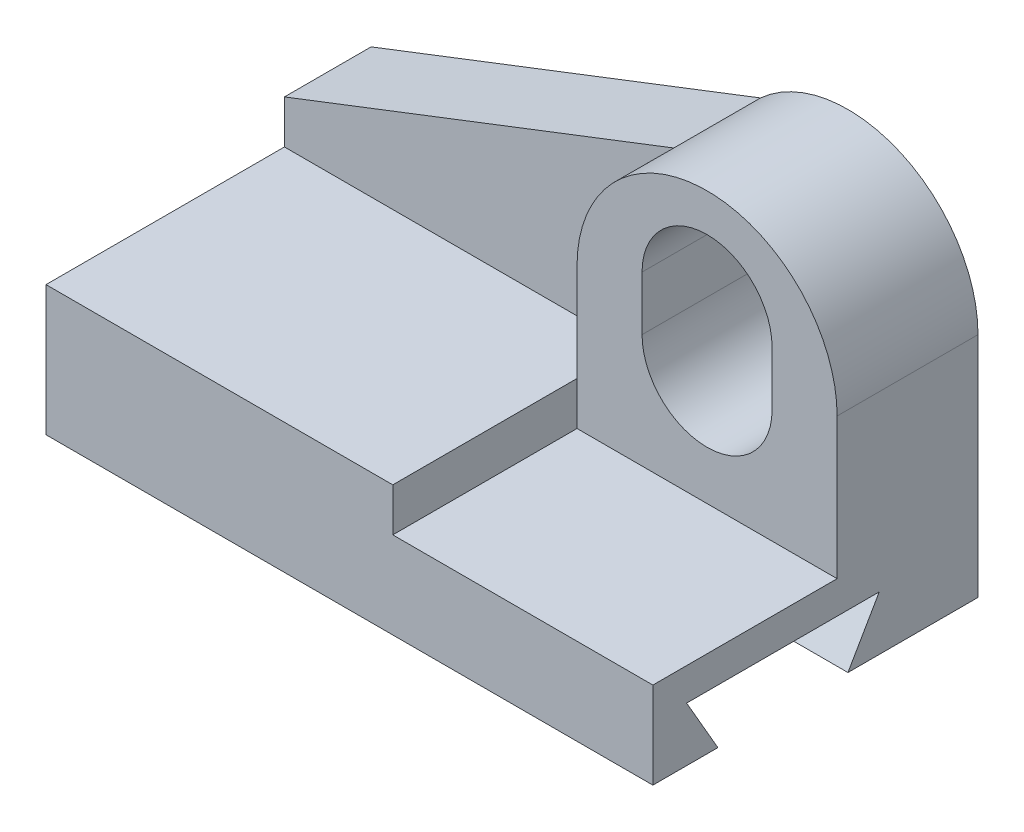
ISO-10303-21;
HEADER;
FILE_DESCRIPTION(('STEP AP214'),'2;1');
FILE_NAME('part.step','',(''),(''),'','','');
FILE_SCHEMA(('AUTOMOTIVE_DESIGN { 1 0 10303 214 1 1 1 1 }'));
ENDSEC;
DATA;
#1=APPLICATION_CONTEXT('core data for automotive mechanical design processes');
#2=APPLICATION_PROTOCOL_DEFINITION('international standard','automotive_design',2000,#1);
#3=PRODUCT_CONTEXT('',#1,'mechanical');
#4=PRODUCT('Part','Part','',(#3));
#5=PRODUCT_RELATED_PRODUCT_CATEGORY('part','',(#4));
#6=PRODUCT_DEFINITION_FORMATION('','',#4);
#7=PRODUCT_DEFINITION_CONTEXT('part definition',#1,'design');
#8=PRODUCT_DEFINITION('design','',#6,#7);
#9=PRODUCT_DEFINITION_SHAPE('','',#8);
#10=(LENGTH_UNIT() NAMED_UNIT(*) SI_UNIT(.MILLI.,.METRE.));
#11=(NAMED_UNIT(*) PLANE_ANGLE_UNIT() SI_UNIT($,.RADIAN.));
#12=(NAMED_UNIT(*) SI_UNIT($,.STERADIAN.) SOLID_ANGLE_UNIT());
#13=UNCERTAINTY_MEASURE_WITH_UNIT(LENGTH_MEASURE(1.E-05),#10,'distance_accuracy_value','');
#14=(GEOMETRIC_REPRESENTATION_CONTEXT(3) GLOBAL_UNCERTAINTY_ASSIGNED_CONTEXT((#13)) GLOBAL_UNIT_ASSIGNED_CONTEXT((#10,
#11,#12)) REPRESENTATION_CONTEXT('',''));
#15=CARTESIAN_POINT('',(0.,0.,0.));
#16=DIRECTION('',(0.,0.,1.));
#17=DIRECTION('',(1.,0.,0.));
#18=AXIS2_PLACEMENT_3D('',#15,#16,#17);
#19=CARTESIAN_POINT('',(0.,8.,0.));
#20=DIRECTION('',(0.,-1.,0.));
#21=DIRECTION('',(0.,0.,-1.));
#22=AXIS2_PLACEMENT_3D('',#19,#20,#21);
#23=PLANE('',#22);
#24=DIRECTION('',(-1.,0.,0.));
#25=VECTOR('',#24,1.);
#26=CARTESIAN_POINT('',(28.,8.,-2.));
#27=LINE('',#26,#25);
#28=CARTESIAN_POINT('',(28.,8.,-2.));
#29=VERTEX_POINT('',#28);
#30=CARTESIAN_POINT('',(4.,8.,-2.));
#31=VERTEX_POINT('',#30);
#32=EDGE_CURVE('E309',#29,#31,#27,.T.);
#33=ORIENTED_EDGE('',*,*,#32,.T.);
#34=DIRECTION('',(0.,0.,-1.));
#35=VECTOR('',#34,1.);
#36=CARTESIAN_POINT('',(4.,8.,15.));
#37=LINE('',#36,#35);
#38=CARTESIAN_POINT('',(4.,8.,15.));
#39=VERTEX_POINT('',#38);
#40=EDGE_CURVE('E222',#39,#31,#37,.T.);
#41=ORIENTED_EDGE('',*,*,#40,.F.);
#42=DIRECTION('',(1.,0.,0.));
#43=VECTOR('',#42,1.);
#44=CARTESIAN_POINT('',(-28.,8.,15.));
#45=LINE('',#44,#43);
#46=CARTESIAN_POINT('',(28.,8.,15.));
#47=VERTEX_POINT('',#46);
#48=EDGE_CURVE('E249',#39,#47,#45,.T.);
#49=ORIENTED_EDGE('',*,*,#48,.T.);
#50=DIRECTION('',(0.,0.,-1.));
#51=VECTOR('',#50,1.);
#52=CARTESIAN_POINT('',(28.,8.,15.));
#53=LINE('',#52,#51);
#54=EDGE_CURVE('E246',#47,#29,#53,.T.);
#55=ORIENTED_EDGE('',*,*,#54,.T.);
#56=EDGE_LOOP('',(#33,#41,#49,#55));
#57=FACE_BOUND('',#56,.T.);
#58=ADVANCED_FACE('F41',(#57),#23,.F.);
#59=CARTESIAN_POINT('',(4.,12.,15.));
#60=DIRECTION('',(-1.,0.,0.));
#61=DIRECTION('',(0.,0.,1.));
#62=AXIS2_PLACEMENT_3D('',#59,#60,#61);
#63=PLANE('',#62);
#64=DIRECTION('',(0.,1.,0.));
#65=VECTOR('',#64,1.);
#66=CARTESIAN_POINT('',(4.,8.,-2.));
#67=LINE('',#66,#65);
#68=CARTESIAN_POINT('',(4.,12.,-2.));
#69=VERTEX_POINT('',#68);
#70=EDGE_CURVE('E301',#31,#69,#67,.T.);
#71=ORIENTED_EDGE('',*,*,#70,.T.);
#72=DIRECTION('',(0.,0.,-1.));
#73=VECTOR('',#72,1.);
#74=CARTESIAN_POINT('',(4.,12.,15.));
#75=LINE('',#74,#73);
#76=CARTESIAN_POINT('',(4.,12.,15.));
#77=VERTEX_POINT('',#76);
#78=EDGE_CURVE('E234',#77,#69,#75,.T.);
#79=ORIENTED_EDGE('',*,*,#78,.F.);
#80=DIRECTION('',(0.,-1.,0.));
#81=VECTOR('',#80,1.);
#82=CARTESIAN_POINT('',(4.,12.,15.));
#83=LINE('',#82,#81);
#84=EDGE_CURVE('E240',#77,#39,#83,.T.);
#85=ORIENTED_EDGE('',*,*,#84,.T.);
#86=ORIENTED_EDGE('',*,*,#40,.T.);
#87=EDGE_LOOP('',(#71,#79,#85,#86));
#88=FACE_BOUND('',#87,.T.);
#89=ADVANCED_FACE('F358',(#88),#63,.F.);
#90=CARTESIAN_POINT('',(0.,0.,0.));
#91=DIRECTION('',(0.,-1.,0.));
#92=DIRECTION('',(0.,0.,-1.));
#93=AXIS2_PLACEMENT_3D('',#90,#91,#92);
#94=PLANE('',#93);
#95=DIRECTION('',(-1.,0.,0.));
#96=VECTOR('',#95,1.);
#97=CARTESIAN_POINT('',(28.,0.,-3.));
#98=LINE('',#97,#96);
#99=CARTESIAN_POINT('',(28.,0.,-3.));
#100=VERTEX_POINT('',#99);
#101=CARTESIAN_POINT('',(-28.,0.,-3.));
#102=VERTEX_POINT('',#101);
#103=EDGE_CURVE('E223',#100,#102,#98,.T.);
#104=ORIENTED_EDGE('',*,*,#103,.T.);
#105=DIRECTION('',(0.,0.,1.));
#106=VECTOR('',#105,1.);
#107=CARTESIAN_POINT('',(-28.,0.,15.));
#108=LINE('',#107,#106);
#109=CARTESIAN_POINT('',(-28.,0.,-15.));
#110=VERTEX_POINT('',#109);
#111=EDGE_CURVE('E258',#110,#102,#108,.T.);
#112=ORIENTED_EDGE('',*,*,#111,.F.);
#113=DIRECTION('',(-1.,0.,0.));
#114=VECTOR('',#113,1.);
#115=CARTESIAN_POINT('',(-28.,0.,-15.));
#116=LINE('',#115,#114);
#117=CARTESIAN_POINT('',(28.,0.,-15.));
#118=VERTEX_POINT('',#117);
#119=EDGE_CURVE('E183',#118,#110,#116,.T.);
#120=ORIENTED_EDGE('',*,*,#119,.F.);
#121=DIRECTION('',(0.,0.,-1.));
#122=VECTOR('',#121,1.);
#123=CARTESIAN_POINT('',(28.,0.,15.));
#124=LINE('',#123,#122);
#125=EDGE_CURVE('E245',#100,#118,#124,.T.);
#126=ORIENTED_EDGE('',*,*,#125,.F.);
#127=EDGE_LOOP('',(#104,#112,#120,#126));
#128=FACE_BOUND('',#127,.T.);
#129=ADVANCED_FACE('F332',(#128),#94,.T.);
#130=CARTESIAN_POINT('',(28.,8.,15.));
#131=DIRECTION('',(-1.,0.,0.));
#132=DIRECTION('',(0.,0.,1.));
#133=AXIS2_PLACEMENT_3D('',#130,#131,#132);
#134=PLANE('',#133);
#135=ORIENTED_EDGE('',*,*,#125,.T.);
#136=DIRECTION('',(0.,-1.,0.));
#137=VECTOR('',#136,1.);
#138=CARTESIAN_POINT('',(28.,8.,-15.));
#139=LINE('',#138,#137);
#140=CARTESIAN_POINT('',(28.,21.,-15.));
#141=VERTEX_POINT('',#140);
#142=EDGE_CURVE('E186',#141,#118,#139,.T.);
#143=ORIENTED_EDGE('',*,*,#142,.F.);
#144=DIRECTION('',(0.,0.,-1.));
#145=VECTOR('',#144,1.);
#146=CARTESIAN_POINT('',(28.,21.,-2.));
#147=LINE('',#146,#145);
#148=CARTESIAN_POINT('',(28.,21.,-2.));
#149=VERTEX_POINT('',#148);
#150=EDGE_CURVE('E198',#149,#141,#147,.T.);
#151=ORIENTED_EDGE('',*,*,#150,.F.);
#152=DIRECTION('',(0.,1.,0.));
#153=VECTOR('',#152,1.);
#154=CARTESIAN_POINT('',(28.,8.,-2.));
#155=LINE('',#154,#153);
#156=EDGE_CURVE('E307',#29,#149,#155,.T.);
#157=ORIENTED_EDGE('',*,*,#156,.F.);
#158=ORIENTED_EDGE('',*,*,#54,.F.);
#159=DIRECTION('',(0.,-1.,0.));
#160=VECTOR('',#159,1.);
#161=CARTESIAN_POINT('',(28.,8.,15.));
#162=LINE('',#161,#160);
#163=CARTESIAN_POINT('',(28.,0.,15.));
#164=VERTEX_POINT('',#163);
#165=EDGE_CURVE('E252',#47,#164,#162,.T.);
#166=ORIENTED_EDGE('',*,*,#165,.T.);
#167=CARTESIAN_POINT('',(28.,0.,9.));
#168=VERTEX_POINT('',#167);
#169=EDGE_CURVE('E253',#164,#168,#124,.T.);
#170=ORIENTED_EDGE('',*,*,#169,.T.);
#171=DIRECTION('',(0.,0.866025403784436,0.500000000000004));
#172=VECTOR('',#171,1.);
#173=CARTESIAN_POINT('',(28.,0.,9.));
#174=LINE('',#173,#172);
#175=CARTESIAN_POINT('',(28.,5.,11.8867513459482));
#176=VERTEX_POINT('',#175);
#177=EDGE_CURVE('E204',#168,#176,#174,.T.);
#178=ORIENTED_EDGE('',*,*,#177,.T.);
#179=DIRECTION('',(0.,0.,1.));
#180=VECTOR('',#179,1.);
#181=CARTESIAN_POINT('',(28.,5.,-5.88675134594812));
#182=LINE('',#181,#180);
#183=CARTESIAN_POINT('',(28.,5.,-5.88675134594812));
#184=VERTEX_POINT('',#183);
#185=EDGE_CURVE('E207',#184,#176,#182,.T.);
#186=ORIENTED_EDGE('',*,*,#185,.F.);
#187=DIRECTION('',(0.,0.86602540378444,-0.499999999999998));
#188=VECTOR('',#187,1.);
#189=CARTESIAN_POINT('',(28.,0.,-3.));
#190=LINE('',#189,#188);
#191=EDGE_CURVE('E210',#100,#184,#190,.T.);
#192=ORIENTED_EDGE('',*,*,#191,.F.);
#193=EDGE_LOOP('',(#135,#143,#151,#157,#158,#166,#170,#178,#186,#192));
#194=FACE_BOUND('',#193,.T.);
#195=ADVANCED_FACE('F43',(#194),#134,.F.);
#196=CARTESIAN_POINT('',(-28.,8.,-15.));
#197=DIRECTION('',(0.,0.,1.));
#198=DIRECTION('',(1.,0.,0.));
#199=AXIS2_PLACEMENT_3D('',#196,#197,#198);
#200=PLANE('',#199);
#201=DIRECTION('',(0.,-1.,0.));
#202=VECTOR('',#201,1.);
#203=CARTESIAN_POINT('',(-28.,8.,-15.));
#204=LINE('',#203,#202);
#205=CARTESIAN_POINT('',(-28.,16.,-15.));
#206=VERTEX_POINT('',#205);
#207=EDGE_CURVE('E178',#206,#110,#204,.T.);
#208=ORIENTED_EDGE('',*,*,#207,.F.);
#209=DIRECTION('',(0.932798134405597,0.360399279202162,0.));
#210=VECTOR('',#209,1.);
#211=CARTESIAN_POINT('',(-28.,16.,-15.));
#212=LINE('',#211,#210);
#213=CARTESIAN_POINT('',(7.93168539325843,29.8826966292135,-15.));
#214=VERTEX_POINT('',#213);
#215=EDGE_CURVE('E56',#206,#214,#212,.T.);
#216=ORIENTED_EDGE('',*,*,#215,.T.);
#217=CARTESIAN_POINT('',(16.,21.,-15.));
#218=DIRECTION('',(0.,0.,-1.));
#219=DIRECTION('',(-1.,0.,0.));
#220=AXIS2_PLACEMENT_3D('',#217,#218,#219);
#221=CIRCLE('',#220,12.);
#222=EDGE_CURVE('E289',#214,#141,#221,.T.);
#223=ORIENTED_EDGE('',*,*,#222,.T.);
#224=ORIENTED_EDGE('',*,*,#142,.T.);
#225=ORIENTED_EDGE('',*,*,#119,.T.);
#226=EDGE_LOOP('',(#208,#216,#223,#224,#225));
#227=FACE_BOUND('',#226,.T.);
#228=DIRECTION('',(0.,-1.,0.));
#229=VECTOR('',#228,1.);
#230=CARTESIAN_POINT('',(22.,18.5,-15.));
#231=LINE('',#230,#229);
#232=CARTESIAN_POINT('',(22.,23.5,-15.));
#233=VERTEX_POINT('',#232);
#234=CARTESIAN_POINT('',(22.,18.5,-15.));
#235=VERTEX_POINT('',#234);
#236=EDGE_CURVE('E369',#233,#235,#231,.T.);
#237=ORIENTED_EDGE('',*,*,#236,.F.);
#238=CARTESIAN_POINT('',(16.,23.5,-15.));
#239=DIRECTION('',(0.,0.,-1.));
#240=DIRECTION('',(1.,0.,0.));
#241=AXIS2_PLACEMENT_3D('',#238,#239,#240);
#242=CIRCLE('',#241,6.);
#243=CARTESIAN_POINT('',(10.,23.5,-15.));
#244=VERTEX_POINT('',#243);
#245=EDGE_CURVE('E365',#244,#233,#242,.T.);
#246=ORIENTED_EDGE('',*,*,#245,.F.);
#247=DIRECTION('',(0.,1.,0.));
#248=VECTOR('',#247,1.);
#249=CARTESIAN_POINT('',(10.,23.5,-15.));
#250=LINE('',#249,#248);
#251=CARTESIAN_POINT('',(10.,18.5,-15.));
#252=VERTEX_POINT('',#251);
#253=EDGE_CURVE('E287',#252,#244,#250,.T.);
#254=ORIENTED_EDGE('',*,*,#253,.F.);
#255=CARTESIAN_POINT('',(16.,18.5,-15.));
#256=DIRECTION('',(0.,0.,-1.));
#257=DIRECTION('',(-1.,0.,0.));
#258=AXIS2_PLACEMENT_3D('',#255,#256,#257);
#259=CIRCLE('',#258,5.99999999999999);
#260=EDGE_CURVE('E370',#235,#252,#259,.T.);
#261=ORIENTED_EDGE('',*,*,#260,.F.);
#262=EDGE_LOOP('',(#237,#246,#254,#261));
#263=FACE_BOUND('',#262,.T.);
#264=ADVANCED_FACE('F179',(#227,#263),#200,.F.);
#265=CARTESIAN_POINT('',(-28.,8.,15.));
#266=DIRECTION('',(1.,0.,0.));
#267=DIRECTION('',(0.,0.,-1.));
#268=AXIS2_PLACEMENT_3D('',#265,#266,#267);
#269=PLANE('',#268);
#270=DIRECTION('',(0.,0.,1.));
#271=VECTOR('',#270,1.);
#272=CARTESIAN_POINT('',(-28.,12.,15.));
#273=LINE('',#272,#271);
#274=CARTESIAN_POINT('',(-28.,12.,-7.));
#275=VERTEX_POINT('',#274);
#276=CARTESIAN_POINT('',(-28.,12.,15.));
#277=VERTEX_POINT('',#276);
#278=EDGE_CURVE('E229',#275,#277,#273,.T.);
#279=ORIENTED_EDGE('',*,*,#278,.F.);
#280=DIRECTION('',(0.,-1.,0.));
#281=VECTOR('',#280,1.);
#282=CARTESIAN_POINT('',(-28.,16.,-7.));
#283=LINE('',#282,#281);
#284=CARTESIAN_POINT('',(-28.,16.,-7.));
#285=VERTEX_POINT('',#284);
#286=EDGE_CURVE('E192',#285,#275,#283,.T.);
#287=ORIENTED_EDGE('',*,*,#286,.F.);
#288=DIRECTION('',(0.,0.,1.));
#289=VECTOR('',#288,1.);
#290=CARTESIAN_POINT('',(-28.,16.,-15.));
#291=LINE('',#290,#289);
#292=EDGE_CURVE('E171',#206,#285,#291,.T.);
#293=ORIENTED_EDGE('',*,*,#292,.F.);
#294=ORIENTED_EDGE('',*,*,#207,.T.);
#295=ORIENTED_EDGE('',*,*,#111,.T.);
#296=DIRECTION('',(0.,0.86602540378444,-0.499999999999998));
#297=VECTOR('',#296,1.);
#298=CARTESIAN_POINT('',(-28.,0.,-3.));
#299=LINE('',#298,#297);
#300=CARTESIAN_POINT('',(-28.,5.,-5.88675134594812));
#301=VERTEX_POINT('',#300);
#302=EDGE_CURVE('E208',#102,#301,#299,.T.);
#303=ORIENTED_EDGE('',*,*,#302,.T.);
#304=DIRECTION('',(0.,0.,1.));
#305=VECTOR('',#304,1.);
#306=CARTESIAN_POINT('',(-28.,5.,-5.88675134594812));
#307=LINE('',#306,#305);
#308=CARTESIAN_POINT('',(-28.,5.,11.8867513459482));
#309=VERTEX_POINT('',#308);
#310=EDGE_CURVE('E215',#301,#309,#307,.T.);
#311=ORIENTED_EDGE('',*,*,#310,.T.);
#312=DIRECTION('',(0.,0.866025403784436,0.500000000000004));
#313=VECTOR('',#312,1.);
#314=CARTESIAN_POINT('',(-28.,0.,9.));
#315=LINE('',#314,#313);
#316=CARTESIAN_POINT('',(-28.,0.,9.));
#317=VERTEX_POINT('',#316);
#318=EDGE_CURVE('E203',#317,#309,#315,.T.);
#319=ORIENTED_EDGE('',*,*,#318,.F.);
#320=CARTESIAN_POINT('',(-28.,0.,15.));
#321=VERTEX_POINT('',#320);
#322=EDGE_CURVE('E257',#317,#321,#108,.T.);
#323=ORIENTED_EDGE('',*,*,#322,.T.);
#324=DIRECTION('',(0.,-1.,0.));
#325=VECTOR('',#324,1.);
#326=CARTESIAN_POINT('',(-28.,8.,15.));
#327=LINE('',#326,#325);
#328=EDGE_CURVE('E187',#277,#321,#327,.T.);
#329=ORIENTED_EDGE('',*,*,#328,.F.);
#330=EDGE_LOOP('',(#279,#287,#293,#294,#295,#303,#311,#319,#323,#329));
#331=FACE_BOUND('',#330,.T.);
#332=ADVANCED_FACE('F191',(#331),#269,.F.);
#333=CARTESIAN_POINT('',(-28.,8.,15.));
#334=DIRECTION('',(0.,0.,-1.));
#335=DIRECTION('',(-1.,0.,0.));
#336=AXIS2_PLACEMENT_3D('',#333,#334,#335);
#337=PLANE('',#336);
#338=DIRECTION('',(1.,0.,0.));
#339=VECTOR('',#338,1.);
#340=CARTESIAN_POINT('',(-28.,0.,15.));
#341=LINE('',#340,#339);
#342=EDGE_CURVE('E250',#321,#164,#341,.T.);
#343=ORIENTED_EDGE('',*,*,#342,.T.);
#344=ORIENTED_EDGE('',*,*,#165,.F.);
#345=ORIENTED_EDGE('',*,*,#48,.F.);
#346=ORIENTED_EDGE('',*,*,#84,.F.);
#347=DIRECTION('',(1.,0.,0.));
#348=VECTOR('',#347,1.);
#349=CARTESIAN_POINT('',(-28.,12.,15.));
#350=LINE('',#349,#348);
#351=EDGE_CURVE('E232',#277,#77,#350,.T.);
#352=ORIENTED_EDGE('',*,*,#351,.F.);
#353=ORIENTED_EDGE('',*,*,#328,.T.);
#354=EDGE_LOOP('',(#343,#344,#345,#346,#352,#353));
#355=FACE_BOUND('',#354,.T.);
#356=ADVANCED_FACE('F351',(#355),#337,.F.);
#357=DIRECTION('',(-1.,0.,0.));
#358=VECTOR('',#357,1.);
#359=CARTESIAN_POINT('',(28.,0.,9.));
#360=LINE('',#359,#358);
#361=EDGE_CURVE('E220',#168,#317,#360,.T.);
#362=ORIENTED_EDGE('',*,*,#361,.F.);
#363=ORIENTED_EDGE('',*,*,#169,.F.);
#364=ORIENTED_EDGE('',*,*,#342,.F.);
#365=ORIENTED_EDGE('',*,*,#322,.F.);
#366=EDGE_LOOP('',(#362,#363,#364,#365));
#367=FACE_BOUND('',#366,.T.);
#368=ADVANCED_FACE('F347',(#367),#94,.T.);
#369=CARTESIAN_POINT('',(0.,12.,0.));
#370=DIRECTION('',(0.,-1.,0.));
#371=DIRECTION('',(0.,0.,-1.));
#372=AXIS2_PLACEMENT_3D('',#369,#370,#371);
#373=PLANE('',#372);
#374=ORIENTED_EDGE('',*,*,#278,.T.);
#375=ORIENTED_EDGE('',*,*,#351,.T.);
#376=ORIENTED_EDGE('',*,*,#78,.T.);
#377=DIRECTION('',(0.,0.,-1.));
#378=VECTOR('',#377,1.);
#379=CARTESIAN_POINT('',(4.,12.,0.));
#380=LINE('',#379,#378);
#381=CARTESIAN_POINT('',(4.,12.,-7.));
#382=VERTEX_POINT('',#381);
#383=EDGE_CURVE('E194',#69,#382,#380,.T.);
#384=ORIENTED_EDGE('',*,*,#383,.T.);
#385=DIRECTION('',(-1.,0.,0.));
#386=VECTOR('',#385,1.);
#387=CARTESIAN_POINT('',(-28.,12.,-7.));
#388=LINE('',#387,#386);
#389=EDGE_CURVE('E237',#382,#275,#388,.T.);
#390=ORIENTED_EDGE('',*,*,#389,.T.);
#391=EDGE_LOOP('',(#374,#375,#376,#384,#390));
#392=FACE_BOUND('',#391,.T.);
#393=ADVANCED_FACE('F360',(#392),#373,.F.);
#394=CARTESIAN_POINT('',(28.,0.,9.));
#395=DIRECTION('',(0.,-0.500000000000004,0.866025403784436));
#396=DIRECTION('',(0.,-0.866025403784437,-0.500000000000004));
#397=AXIS2_PLACEMENT_3D('',#394,#395,#396);
#398=PLANE('',#397);
#399=ORIENTED_EDGE('',*,*,#318,.T.);
#400=DIRECTION('',(-1.,0.,0.));
#401=VECTOR('',#400,1.);
#402=CARTESIAN_POINT('',(28.,5.,11.8867513459482));
#403=LINE('',#402,#401);
#404=EDGE_CURVE('E212',#176,#309,#403,.T.);
#405=ORIENTED_EDGE('',*,*,#404,.F.);
#406=ORIENTED_EDGE('',*,*,#177,.F.);
#407=ORIENTED_EDGE('',*,*,#361,.T.);
#408=EDGE_LOOP('',(#399,#405,#406,#407));
#409=FACE_BOUND('',#408,.T.);
#410=ADVANCED_FACE('F426',(#409),#398,.F.);
#411=CARTESIAN_POINT('',(28.,0.,-3.));
#412=DIRECTION('',(0.,0.499999999999998,0.86602540378444));
#413=DIRECTION('',(0.,-0.86602540378444,0.499999999999998));
#414=AXIS2_PLACEMENT_3D('',#411,#412,#413);
#415=PLANE('',#414);
#416=ORIENTED_EDGE('',*,*,#302,.F.);
#417=ORIENTED_EDGE('',*,*,#103,.F.);
#418=ORIENTED_EDGE('',*,*,#191,.T.);
#419=DIRECTION('',(-1.,0.,0.));
#420=VECTOR('',#419,1.);
#421=CARTESIAN_POINT('',(28.,5.,-5.88675134594812));
#422=LINE('',#421,#420);
#423=EDGE_CURVE('E226',#184,#301,#422,.T.);
#424=ORIENTED_EDGE('',*,*,#423,.T.);
#425=EDGE_LOOP('',(#416,#417,#418,#424));
#426=FACE_BOUND('',#425,.T.);
#427=ADVANCED_FACE('F335',(#426),#415,.T.);
#428=CARTESIAN_POINT('',(28.,5.,-5.88675134594812));
#429=DIRECTION('',(0.,-1.,0.));
#430=DIRECTION('',(0.,0.,-1.));
#431=AXIS2_PLACEMENT_3D('',#428,#429,#430);
#432=PLANE('',#431);
#433=ORIENTED_EDGE('',*,*,#310,.F.);
#434=ORIENTED_EDGE('',*,*,#423,.F.);
#435=ORIENTED_EDGE('',*,*,#185,.T.);
#436=ORIENTED_EDGE('',*,*,#404,.T.);
#437=EDGE_LOOP('',(#433,#434,#435,#436));
#438=FACE_BOUND('',#437,.T.);
#439=ADVANCED_FACE('F339',(#438),#432,.T.);
#440=CARTESIAN_POINT('',(-28.,16.,-7.));
#441=DIRECTION('',(0.,0.,-1.));
#442=DIRECTION('',(-1.,0.,0.));
#443=AXIS2_PLACEMENT_3D('',#440,#441,#442);
#444=PLANE('',#443);
#445=ORIENTED_EDGE('',*,*,#286,.T.);
#446=ORIENTED_EDGE('',*,*,#389,.F.);
#447=DIRECTION('',(0.,-1.,0.));
#448=VECTOR('',#447,1.);
#449=CARTESIAN_POINT('',(4.,16.,-7.));
#450=LINE('',#449,#448);
#451=CARTESIAN_POINT('',(4.,21.,-7.));
#452=VERTEX_POINT('',#451);
#453=EDGE_CURVE('E193',#452,#382,#450,.T.);
#454=ORIENTED_EDGE('',*,*,#453,.F.);
#455=CARTESIAN_POINT('',(16.,21.,-7.));
#456=DIRECTION('',(0.,0.,1.));
#457=DIRECTION('',(1.,0.,0.));
#458=AXIS2_PLACEMENT_3D('',#455,#456,#457);
#459=CIRCLE('',#458,12.);
#460=CARTESIAN_POINT('',(7.93168539325843,29.8826966292135,-7.));
#461=VERTEX_POINT('',#460);
#462=EDGE_CURVE('E322',#452,#461,#459,.F.);
#463=ORIENTED_EDGE('',*,*,#462,.T.);
#464=DIRECTION('',(0.932798134405597,0.360399279202162,0.));
#465=VECTOR('',#464,1.);
#466=CARTESIAN_POINT('',(-28.,16.,-7.));
#467=LINE('',#466,#465);
#468=EDGE_CURVE('E175',#285,#461,#467,.T.);
#469=ORIENTED_EDGE('',*,*,#468,.F.);
#470=EDGE_LOOP('',(#445,#446,#454,#463,#469));
#471=FACE_BOUND('',#470,.T.);
#472=ADVANCED_FACE('F363',(#471),#444,.F.);
#473=CARTESIAN_POINT('',(4.,8.,-2.));
#474=DIRECTION('',(-1.,0.,0.));
#475=DIRECTION('',(0.,0.,1.));
#476=AXIS2_PLACEMENT_3D('',#473,#474,#475);
#477=PLANE('',#476);
#478=DIRECTION('',(0.,0.,-1.));
#479=VECTOR('',#478,1.);
#480=CARTESIAN_POINT('',(4.,21.,-2.));
#481=LINE('',#480,#479);
#482=CARTESIAN_POINT('',(4.,21.,-2.));
#483=VERTEX_POINT('',#482);
#484=EDGE_CURVE('E311',#483,#452,#481,.T.);
#485=ORIENTED_EDGE('',*,*,#484,.T.);
#486=ORIENTED_EDGE('',*,*,#453,.T.);
#487=ORIENTED_EDGE('',*,*,#383,.F.);
#488=EDGE_CURVE('E292',#69,#483,#67,.T.);
#489=ORIENTED_EDGE('',*,*,#488,.T.);
#490=EDGE_LOOP('',(#485,#486,#487,#489));
#491=FACE_BOUND('',#490,.T.);
#492=ADVANCED_FACE('F316',(#491),#477,.T.);
#493=CARTESIAN_POINT('',(16.,21.,-2.));
#494=DIRECTION('',(0.,0.,-1.));
#495=DIRECTION('',(-1.,0.,0.));
#496=AXIS2_PLACEMENT_3D('',#493,#494,#495);
#497=CYLINDRICAL_SURFACE('',#496,12.);
#498=ORIENTED_EDGE('',*,*,#150,.T.);
#499=ORIENTED_EDGE('',*,*,#222,.F.);
#500=DIRECTION('',(0.,0.,-1.));
#501=VECTOR('',#500,1.);
#502=CARTESIAN_POINT('',(7.93168539325844,29.8826966292135,-2.));
#503=LINE('',#502,#501);
#504=EDGE_CURVE('E11',#461,#214,#503,.T.);
#505=ORIENTED_EDGE('',*,*,#504,.F.);
#506=ORIENTED_EDGE('',*,*,#462,.F.);
#507=ORIENTED_EDGE('',*,*,#484,.F.);
#508=CARTESIAN_POINT('',(16.,21.,-2.));
#509=DIRECTION('',(0.,0.,-1.));
#510=DIRECTION('',(-1.,0.,0.));
#511=AXIS2_PLACEMENT_3D('',#508,#509,#510);
#512=CIRCLE('',#511,12.);
#513=EDGE_CURVE('E304',#483,#149,#512,.T.);
#514=ORIENTED_EDGE('',*,*,#513,.T.);
#515=EDGE_LOOP('',(#498,#499,#505,#506,#507,#514));
#516=FACE_BOUND('',#515,.T.);
#517=ADVANCED_FACE('F321',(#516),#497,.T.);
#518=CARTESIAN_POINT('',(16.,21.,-2.));
#519=DIRECTION('',(0.,0.,-1.));
#520=DIRECTION('',(-1.,0.,0.));
#521=AXIS2_PLACEMENT_3D('',#518,#519,#520);
#522=PLANE('',#521);
#523=DIRECTION('',(0.,1.,0.));
#524=VECTOR('',#523,1.);
#525=CARTESIAN_POINT('',(10.,21.,-2.));
#526=LINE('',#525,#524);
#527=CARTESIAN_POINT('',(10.,18.5,-2.));
#528=VERTEX_POINT('',#527);
#529=CARTESIAN_POINT('',(10.,23.5,-2.));
#530=VERTEX_POINT('',#529);
#531=EDGE_CURVE('E272',#528,#530,#526,.T.);
#532=ORIENTED_EDGE('',*,*,#531,.T.);
#533=CARTESIAN_POINT('',(16.,23.5,-2.));
#534=DIRECTION('',(0.,0.,-1.));
#535=DIRECTION('',(-1.,0.,0.));
#536=AXIS2_PLACEMENT_3D('',#533,#534,#535);
#537=CIRCLE('',#536,6.);
#538=CARTESIAN_POINT('',(22.,23.5,-2.));
#539=VERTEX_POINT('',#538);
#540=EDGE_CURVE('E49',#530,#539,#537,.T.);
#541=ORIENTED_EDGE('',*,*,#540,.T.);
#542=DIRECTION('',(0.,-1.,0.));
#543=VECTOR('',#542,1.);
#544=CARTESIAN_POINT('',(22.,21.,-2.));
#545=LINE('',#544,#543);
#546=CARTESIAN_POINT('',(22.,18.5,-2.));
#547=VERTEX_POINT('',#546);
#548=EDGE_CURVE('E266',#539,#547,#545,.T.);
#549=ORIENTED_EDGE('',*,*,#548,.T.);
#550=CARTESIAN_POINT('',(16.,18.5,-2.));
#551=DIRECTION('',(0.,0.,-1.));
#552=DIRECTION('',(-1.,0.,0.));
#553=AXIS2_PLACEMENT_3D('',#550,#551,#552);
#554=CIRCLE('',#553,5.99999999999999);
#555=EDGE_CURVE('E269',#547,#528,#554,.T.);
#556=ORIENTED_EDGE('',*,*,#555,.T.);
#557=EDGE_LOOP('',(#532,#541,#549,#556));
#558=FACE_BOUND('',#557,.T.);
#559=ORIENTED_EDGE('',*,*,#70,.F.);
#560=ORIENTED_EDGE('',*,*,#32,.F.);
#561=ORIENTED_EDGE('',*,*,#156,.T.);
#562=ORIENTED_EDGE('',*,*,#513,.F.);
#563=ORIENTED_EDGE('',*,*,#488,.F.);
#564=EDGE_LOOP('',(#559,#560,#561,#562,#563));
#565=FACE_BOUND('',#564,.T.);
#566=ADVANCED_FACE('F276',(#558,#565),#522,.F.);
#567=CARTESIAN_POINT('',(16.,23.5,15.));
#568=DIRECTION('',(0.,0.,-1.));
#569=DIRECTION('',(-1.,0.,0.));
#570=AXIS2_PLACEMENT_3D('',#567,#568,#569);
#571=CYLINDRICAL_SURFACE('',#570,6.);
#572=DIRECTION('',(0.,0.,-1.));
#573=VECTOR('',#572,1.);
#574=CARTESIAN_POINT('',(10.,23.5,15.));
#575=LINE('',#574,#573);
#576=EDGE_CURVE('E281',#530,#244,#575,.T.);
#577=ORIENTED_EDGE('',*,*,#576,.T.);
#578=ORIENTED_EDGE('',*,*,#245,.T.);
#579=DIRECTION('',(0.,0.,-1.));
#580=VECTOR('',#579,1.);
#581=CARTESIAN_POINT('',(22.,23.5,15.));
#582=LINE('',#581,#580);
#583=EDGE_CURVE('E63',#539,#233,#582,.T.);
#584=ORIENTED_EDGE('',*,*,#583,.F.);
#585=ORIENTED_EDGE('',*,*,#540,.F.);
#586=EDGE_LOOP('',(#577,#578,#584,#585));
#587=FACE_BOUND('',#586,.T.);
#588=ADVANCED_FACE('F280',(#587),#571,.F.);
#589=CARTESIAN_POINT('',(10.,23.5,15.));
#590=DIRECTION('',(-1.,0.,0.));
#591=DIRECTION('',(0.,-1.,0.));
#592=AXIS2_PLACEMENT_3D('',#589,#590,#591);
#593=PLANE('',#592);
#594=DIRECTION('',(0.,0.,-1.));
#595=VECTOR('',#594,1.);
#596=CARTESIAN_POINT('',(10.,18.5,15.));
#597=LINE('',#596,#595);
#598=EDGE_CURVE('E290',#528,#252,#597,.T.);
#599=ORIENTED_EDGE('',*,*,#598,.T.);
#600=ORIENTED_EDGE('',*,*,#253,.T.);
#601=ORIENTED_EDGE('',*,*,#576,.F.);
#602=ORIENTED_EDGE('',*,*,#531,.F.);
#603=EDGE_LOOP('',(#599,#600,#601,#602));
#604=FACE_BOUND('',#603,.T.);
#605=ADVANCED_FACE('F284',(#604),#593,.F.);
#606=CARTESIAN_POINT('',(16.,18.5,15.));
#607=DIRECTION('',(0.,0.,-1.));
#608=DIRECTION('',(-1.,0.,0.));
#609=AXIS2_PLACEMENT_3D('',#606,#607,#608);
#610=CYLINDRICAL_SURFACE('',#609,5.99999999999999);
#611=DIRECTION('',(0.,0.,-1.));
#612=VECTOR('',#611,1.);
#613=CARTESIAN_POINT('',(22.,18.5,15.));
#614=LINE('',#613,#612);
#615=EDGE_CURVE('E294',#547,#235,#614,.T.);
#616=ORIENTED_EDGE('',*,*,#615,.T.);
#617=ORIENTED_EDGE('',*,*,#260,.T.);
#618=ORIENTED_EDGE('',*,*,#598,.F.);
#619=ORIENTED_EDGE('',*,*,#555,.F.);
#620=EDGE_LOOP('',(#616,#617,#618,#619));
#621=FACE_BOUND('',#620,.T.);
#622=ADVANCED_FACE('F374',(#621),#610,.F.);
#623=CARTESIAN_POINT('',(22.,18.5,15.));
#624=DIRECTION('',(1.,0.,0.));
#625=DIRECTION('',(0.,1.,0.));
#626=AXIS2_PLACEMENT_3D('',#623,#624,#625);
#627=PLANE('',#626);
#628=ORIENTED_EDGE('',*,*,#583,.T.);
#629=ORIENTED_EDGE('',*,*,#236,.T.);
#630=ORIENTED_EDGE('',*,*,#615,.F.);
#631=ORIENTED_EDGE('',*,*,#548,.F.);
#632=EDGE_LOOP('',(#628,#629,#630,#631));
#633=FACE_BOUND('',#632,.T.);
#634=ADVANCED_FACE('F377',(#633),#627,.F.);
#635=CARTESIAN_POINT('',(-28.,16.,-11.));
#636=DIRECTION('',(0.360399279202162,-0.932798134405597,0.));
#637=DIRECTION('',(0.932798134405597,0.360399279202162,0.));
#638=AXIS2_PLACEMENT_3D('',#635,#636,#637);
#639=PLANE('',#638);
#640=ORIENTED_EDGE('',*,*,#215,.F.);
#641=ORIENTED_EDGE('',*,*,#292,.T.);
#642=ORIENTED_EDGE('',*,*,#468,.T.);
#643=ORIENTED_EDGE('',*,*,#504,.T.);
#644=EDGE_LOOP('',(#640,#641,#642,#643));
#645=FACE_BOUND('',#644,.T.);
#646=ADVANCED_FACE('F168',(#645),#639,.F.);
#647=CLOSED_SHELL('',(#58,#89,#129,#195,#264,#332,#356,#368,#393,#410,#427,#439,#472,#492,#517,
#566,#588,#605,#622,#634,#646));
#648=MANIFOLD_SOLID_BREP('B2',#647);
#649=ADVANCED_BREP_SHAPE_REPRESENTATION('',(#18,#648),#14);
#650=SHAPE_DEFINITION_REPRESENTATION(#9,#649);
ENDSEC;
END-ISO-10303-21;
